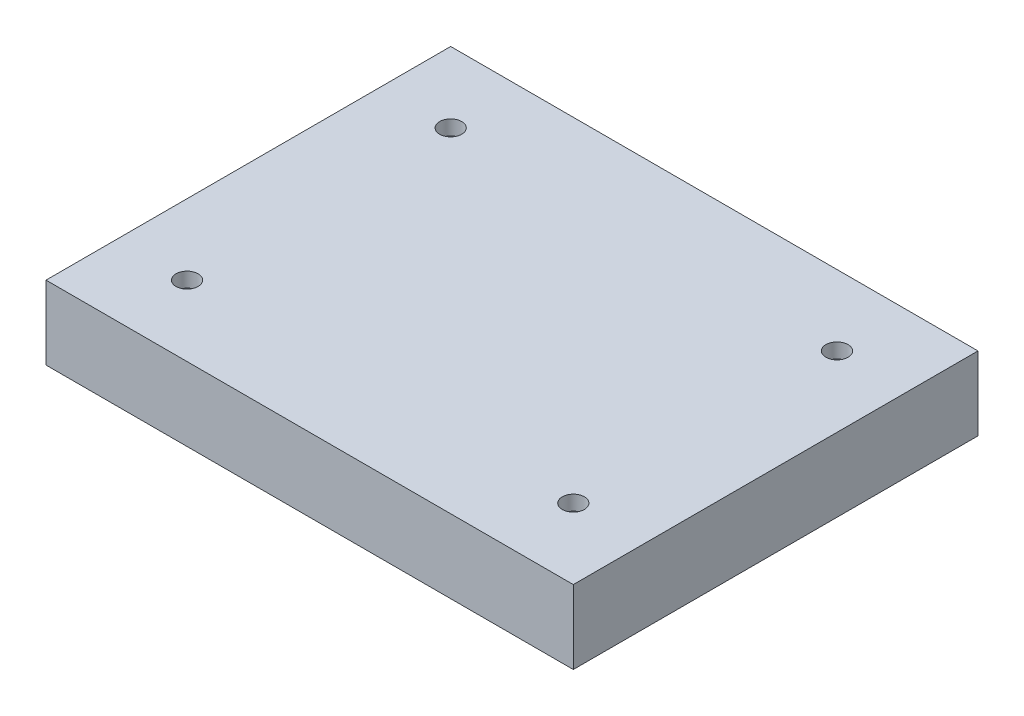
ISO-10303-21;
HEADER;
FILE_DESCRIPTION(('STEP AP214'),'2;1');
FILE_NAME('part.step','',(''),(''),'','','');
FILE_SCHEMA(('AUTOMOTIVE_DESIGN { 1 0 10303 214 1 1 1 1 }'));
ENDSEC;
DATA;
#1=APPLICATION_CONTEXT('core data for automotive mechanical design processes');
#2=APPLICATION_PROTOCOL_DEFINITION('international standard','automotive_design',2000,#1);
#3=PRODUCT_CONTEXT('',#1,'mechanical');
#4=PRODUCT('Part','Part','',(#3));
#5=PRODUCT_RELATED_PRODUCT_CATEGORY('part','',(#4));
#6=PRODUCT_DEFINITION_FORMATION('','',#4);
#7=PRODUCT_DEFINITION_CONTEXT('part definition',#1,'design');
#8=PRODUCT_DEFINITION('design','',#6,#7);
#9=PRODUCT_DEFINITION_SHAPE('','',#8);
#10=(LENGTH_UNIT() NAMED_UNIT(*) SI_UNIT(.MILLI.,.METRE.));
#11=(NAMED_UNIT(*) PLANE_ANGLE_UNIT() SI_UNIT($,.RADIAN.));
#12=(NAMED_UNIT(*) SI_UNIT($,.STERADIAN.) SOLID_ANGLE_UNIT());
#13=UNCERTAINTY_MEASURE_WITH_UNIT(LENGTH_MEASURE(1.E-05),#10,'distance_accuracy_value','');
#14=(GEOMETRIC_REPRESENTATION_CONTEXT(3) GLOBAL_UNCERTAINTY_ASSIGNED_CONTEXT((#13)) GLOBAL_UNIT_ASSIGNED_CONTEXT((#10,
#11,#12)) REPRESENTATION_CONTEXT('',''));
#15=CARTESIAN_POINT('',(0.,0.,0.));
#16=DIRECTION('',(0.,0.,1.));
#17=DIRECTION('',(1.,0.,0.));
#18=AXIS2_PLACEMENT_3D('',#15,#16,#17);
#19=CARTESIAN_POINT('',(43.,12.,33.));
#20=DIRECTION('',(-1.,0.,0.));
#21=DIRECTION('',(0.,0.,1.));
#22=AXIS2_PLACEMENT_3D('',#19,#20,#21);
#23=PLANE('',#22);
#24=DIRECTION('',(0.,0.,-1.));
#25=VECTOR('',#24,1.);
#26=CARTESIAN_POINT('',(43.,0.,33.));
#27=LINE('',#26,#25);
#28=CARTESIAN_POINT('',(43.,0.,33.));
#29=VERTEX_POINT('',#28);
#30=CARTESIAN_POINT('',(43.,0.,-33.));
#31=VERTEX_POINT('',#30);
#32=EDGE_CURVE('E153',#29,#31,#27,.T.);
#33=ORIENTED_EDGE('',*,*,#32,.T.);
#34=DIRECTION('',(0.,-1.,0.));
#35=VECTOR('',#34,1.);
#36=CARTESIAN_POINT('',(43.,12.,-33.));
#37=LINE('',#36,#35);
#38=CARTESIAN_POINT('',(43.,12.,-33.));
#39=VERTEX_POINT('',#38);
#40=EDGE_CURVE('E180',#39,#31,#37,.T.);
#41=ORIENTED_EDGE('',*,*,#40,.F.);
#42=DIRECTION('',(0.,0.,-1.));
#43=VECTOR('',#42,1.);
#44=CARTESIAN_POINT('',(43.,12.,33.));
#45=LINE('',#44,#43);
#46=CARTESIAN_POINT('',(43.,12.,33.));
#47=VERTEX_POINT('',#46);
#48=EDGE_CURVE('E160',#47,#39,#45,.T.);
#49=ORIENTED_EDGE('',*,*,#48,.F.);
#50=DIRECTION('',(0.,-1.,0.));
#51=VECTOR('',#50,1.);
#52=CARTESIAN_POINT('',(43.,12.,33.));
#53=LINE('',#52,#51);
#54=EDGE_CURVE('E162',#47,#29,#53,.T.);
#55=ORIENTED_EDGE('',*,*,#54,.T.);
#56=EDGE_LOOP('',(#33,#41,#49,#55));
#57=FACE_BOUND('',#56,.T.);
#58=ADVANCED_FACE('F39',(#57),#23,.F.);
#59=CARTESIAN_POINT('',(-43.,12.,-33.));
#60=DIRECTION('',(0.,0.,1.));
#61=DIRECTION('',(1.,0.,0.));
#62=AXIS2_PLACEMENT_3D('',#59,#60,#61);
#63=PLANE('',#62);
#64=DIRECTION('',(-1.,0.,0.));
#65=VECTOR('',#64,1.);
#66=CARTESIAN_POINT('',(-43.,0.,-33.));
#67=LINE('',#66,#65);
#68=CARTESIAN_POINT('',(-43.,0.,-33.));
#69=VERTEX_POINT('',#68);
#70=EDGE_CURVE('E167',#31,#69,#67,.T.);
#71=ORIENTED_EDGE('',*,*,#70,.T.);
#72=DIRECTION('',(0.,-1.,0.));
#73=VECTOR('',#72,1.);
#74=CARTESIAN_POINT('',(-43.,12.,-33.));
#75=LINE('',#74,#73);
#76=CARTESIAN_POINT('',(-43.,12.,-33.));
#77=VERTEX_POINT('',#76);
#78=EDGE_CURVE('E171',#77,#69,#75,.T.);
#79=ORIENTED_EDGE('',*,*,#78,.F.);
#80=DIRECTION('',(-1.,0.,0.));
#81=VECTOR('',#80,1.);
#82=CARTESIAN_POINT('',(-43.,12.,-33.));
#83=LINE('',#82,#81);
#84=EDGE_CURVE('E91',#39,#77,#83,.T.);
#85=ORIENTED_EDGE('',*,*,#84,.F.);
#86=ORIENTED_EDGE('',*,*,#40,.T.);
#87=EDGE_LOOP('',(#71,#79,#85,#86));
#88=FACE_BOUND('',#87,.T.);
#89=ADVANCED_FACE('F240',(#88),#63,.F.);
#90=CARTESIAN_POINT('',(-43.,12.,33.));
#91=DIRECTION('',(1.,0.,0.));
#92=DIRECTION('',(0.,0.,-1.));
#93=AXIS2_PLACEMENT_3D('',#90,#91,#92);
#94=PLANE('',#93);
#95=DIRECTION('',(0.,0.,1.));
#96=VECTOR('',#95,1.);
#97=CARTESIAN_POINT('',(-43.,0.,33.));
#98=LINE('',#97,#96);
#99=CARTESIAN_POINT('',(-43.,0.,33.));
#100=VERTEX_POINT('',#99);
#101=EDGE_CURVE('E169',#69,#100,#98,.T.);
#102=ORIENTED_EDGE('',*,*,#101,.T.);
#103=DIRECTION('',(0.,-1.,0.));
#104=VECTOR('',#103,1.);
#105=CARTESIAN_POINT('',(-43.,12.,33.));
#106=LINE('',#105,#104);
#107=CARTESIAN_POINT('',(-43.,12.,33.));
#108=VERTEX_POINT('',#107);
#109=EDGE_CURVE('E175',#108,#100,#106,.T.);
#110=ORIENTED_EDGE('',*,*,#109,.F.);
#111=DIRECTION('',(0.,0.,1.));
#112=VECTOR('',#111,1.);
#113=CARTESIAN_POINT('',(-43.,12.,33.));
#114=LINE('',#113,#112);
#115=EDGE_CURVE('E159',#77,#108,#114,.T.);
#116=ORIENTED_EDGE('',*,*,#115,.F.);
#117=ORIENTED_EDGE('',*,*,#78,.T.);
#118=EDGE_LOOP('',(#102,#110,#116,#117));
#119=FACE_BOUND('',#118,.T.);
#120=ADVANCED_FACE('F245',(#119),#94,.F.);
#121=CARTESIAN_POINT('',(-43.,12.,33.));
#122=DIRECTION('',(0.,0.,-1.));
#123=DIRECTION('',(-1.,0.,0.));
#124=AXIS2_PLACEMENT_3D('',#121,#122,#123);
#125=PLANE('',#124);
#126=DIRECTION('',(1.,0.,0.));
#127=VECTOR('',#126,1.);
#128=CARTESIAN_POINT('',(-43.,0.,33.));
#129=LINE('',#128,#127);
#130=EDGE_CURVE('E82',#100,#29,#129,.T.);
#131=ORIENTED_EDGE('',*,*,#130,.T.);
#132=ORIENTED_EDGE('',*,*,#54,.F.);
#133=DIRECTION('',(1.,0.,0.));
#134=VECTOR('',#133,1.);
#135=CARTESIAN_POINT('',(-43.,12.,33.));
#136=LINE('',#135,#134);
#137=EDGE_CURVE('E61',#108,#47,#136,.T.);
#138=ORIENTED_EDGE('',*,*,#137,.F.);
#139=ORIENTED_EDGE('',*,*,#109,.T.);
#140=EDGE_LOOP('',(#131,#132,#138,#139));
#141=FACE_BOUND('',#140,.T.);
#142=ADVANCED_FACE('F255',(#141),#125,.F.);
#143=CARTESIAN_POINT('',(0.,12.,0.));
#144=DIRECTION('',(0.,-1.,0.));
#145=DIRECTION('',(0.,0.,-1.));
#146=AXIS2_PLACEMENT_3D('',#143,#144,#145);
#147=PLANE('',#146);
#148=CARTESIAN_POINT('',(31.5,12.,-21.5));
#149=DIRECTION('',(0.,-1.,0.));
#150=DIRECTION('',(0.,0.,-1.));
#151=AXIS2_PLACEMENT_3D('',#148,#149,#150);
#152=CIRCLE('',#151,1.8);
#153=CARTESIAN_POINT('',(31.5,12.,-23.3));
#154=VERTEX_POINT('',#153);
#155=EDGE_CURVE('E45',#154,#154,#152,.T.);
#156=ORIENTED_EDGE('',*,*,#155,.T.);
#157=EDGE_LOOP('',(#156));
#158=FACE_BOUND('',#157,.T.);
#159=CARTESIAN_POINT('',(-31.5,12.,21.5));
#160=DIRECTION('',(0.,-1.,0.));
#161=DIRECTION('',(0.,0.,-1.));
#162=AXIS2_PLACEMENT_3D('',#159,#160,#161);
#163=CIRCLE('',#162,1.8);
#164=CARTESIAN_POINT('',(-31.5,12.,19.7));
#165=VERTEX_POINT('',#164);
#166=EDGE_CURVE('E191',#165,#165,#163,.T.);
#167=ORIENTED_EDGE('',*,*,#166,.T.);
#168=EDGE_LOOP('',(#167));
#169=FACE_BOUND('',#168,.T.);
#170=CARTESIAN_POINT('',(31.5,12.,21.5));
#171=DIRECTION('',(0.,-1.,0.));
#172=DIRECTION('',(0.,0.,-1.));
#173=AXIS2_PLACEMENT_3D('',#170,#171,#172);
#174=CIRCLE('',#173,1.8);
#175=CARTESIAN_POINT('',(31.5,12.,19.7));
#176=VERTEX_POINT('',#175);
#177=EDGE_CURVE('E188',#176,#176,#174,.T.);
#178=ORIENTED_EDGE('',*,*,#177,.T.);
#179=EDGE_LOOP('',(#178));
#180=FACE_BOUND('',#179,.T.);
#181=CARTESIAN_POINT('',(-31.5,12.,-21.5));
#182=DIRECTION('',(0.,-1.,0.));
#183=DIRECTION('',(0.,0.,-1.));
#184=AXIS2_PLACEMENT_3D('',#181,#182,#183);
#185=CIRCLE('',#184,1.8);
#186=CARTESIAN_POINT('',(-31.5,12.,-23.3));
#187=VERTEX_POINT('',#186);
#188=EDGE_CURVE('E190',#187,#187,#185,.T.);
#189=ORIENTED_EDGE('',*,*,#188,.T.);
#190=EDGE_LOOP('',(#189));
#191=FACE_BOUND('',#190,.T.);
#192=ORIENTED_EDGE('',*,*,#48,.T.);
#193=ORIENTED_EDGE('',*,*,#84,.T.);
#194=ORIENTED_EDGE('',*,*,#115,.T.);
#195=ORIENTED_EDGE('',*,*,#137,.T.);
#196=EDGE_LOOP('',(#192,#193,#194,#195));
#197=FACE_BOUND('',#196,.T.);
#198=ADVANCED_FACE('F252',(#158,#169,#180,#191,#197),#147,.F.);
#199=CARTESIAN_POINT('',(0.,0.,0.));
#200=DIRECTION('',(0.,-1.,0.));
#201=DIRECTION('',(0.,0.,-1.));
#202=AXIS2_PLACEMENT_3D('',#199,#200,#201);
#203=PLANE('',#202);
#204=DIRECTION('',(0.,0.,1.));
#205=VECTOR('',#204,1.);
#206=CARTESIAN_POINT('',(40.6,0.,-30.6));
#207=LINE('',#206,#205);
#208=CARTESIAN_POINT('',(40.6,0.,-30.6));
#209=VERTEX_POINT('',#208);
#210=CARTESIAN_POINT('',(40.6,0.,30.6));
#211=VERTEX_POINT('',#210);
#212=EDGE_CURVE('E54',#209,#211,#207,.T.);
#213=ORIENTED_EDGE('',*,*,#212,.F.);
#214=DIRECTION('',(1.,0.,0.));
#215=VECTOR('',#214,1.);
#216=CARTESIAN_POINT('',(-40.6,0.,-30.6));
#217=LINE('',#216,#215);
#218=CARTESIAN_POINT('',(-40.6,0.,-30.6));
#219=VERTEX_POINT('',#218);
#220=EDGE_CURVE('E133',#219,#209,#217,.T.);
#221=ORIENTED_EDGE('',*,*,#220,.F.);
#222=DIRECTION('',(0.,0.,-1.));
#223=VECTOR('',#222,1.);
#224=CARTESIAN_POINT('',(-40.6,0.,-30.6));
#225=LINE('',#224,#223);
#226=CARTESIAN_POINT('',(-40.6,0.,30.6));
#227=VERTEX_POINT('',#226);
#228=EDGE_CURVE('E136',#227,#219,#225,.T.);
#229=ORIENTED_EDGE('',*,*,#228,.F.);
#230=DIRECTION('',(-1.,0.,0.));
#231=VECTOR('',#230,1.);
#232=CARTESIAN_POINT('',(-40.6,0.,30.6));
#233=LINE('',#232,#231);
#234=EDGE_CURVE('E150',#211,#227,#233,.T.);
#235=ORIENTED_EDGE('',*,*,#234,.F.);
#236=EDGE_LOOP('',(#213,#221,#229,#235));
#237=FACE_BOUND('',#236,.T.);
#238=ORIENTED_EDGE('',*,*,#32,.F.);
#239=ORIENTED_EDGE('',*,*,#130,.F.);
#240=ORIENTED_EDGE('',*,*,#101,.F.);
#241=ORIENTED_EDGE('',*,*,#70,.F.);
#242=EDGE_LOOP('',(#238,#239,#240,#241));
#243=FACE_BOUND('',#242,.T.);
#244=ADVANCED_FACE('F250',(#237,#243),#203,.T.);
#245=CARTESIAN_POINT('',(40.6,9.6,-30.6));
#246=DIRECTION('',(1.,0.,0.));
#247=DIRECTION('',(0.,0.,-1.));
#248=AXIS2_PLACEMENT_3D('',#245,#246,#247);
#249=PLANE('',#248);
#250=ORIENTED_EDGE('',*,*,#212,.T.);
#251=DIRECTION('',(0.,-1.,0.));
#252=VECTOR('',#251,1.);
#253=CARTESIAN_POINT('',(40.6,9.6,30.6));
#254=LINE('',#253,#252);
#255=CARTESIAN_POINT('',(40.6,9.6,30.6));
#256=VERTEX_POINT('',#255);
#257=EDGE_CURVE('E114',#256,#211,#254,.T.);
#258=ORIENTED_EDGE('',*,*,#257,.F.);
#259=DIRECTION('',(0.,0.,1.));
#260=VECTOR('',#259,1.);
#261=CARTESIAN_POINT('',(40.6,9.6,-30.6));
#262=LINE('',#261,#260);
#263=CARTESIAN_POINT('',(40.6,9.6,-30.6));
#264=VERTEX_POINT('',#263);
#265=EDGE_CURVE('E120',#264,#256,#262,.T.);
#266=ORIENTED_EDGE('',*,*,#265,.F.);
#267=DIRECTION('',(0.,-1.,0.));
#268=VECTOR('',#267,1.);
#269=CARTESIAN_POINT('',(40.6,9.6,-30.6));
#270=LINE('',#269,#268);
#271=EDGE_CURVE('E151',#264,#209,#270,.T.);
#272=ORIENTED_EDGE('',*,*,#271,.T.);
#273=EDGE_LOOP('',(#250,#258,#266,#272));
#274=FACE_BOUND('',#273,.T.);
#275=ADVANCED_FACE('F113',(#274),#249,.F.);
#276=CARTESIAN_POINT('',(-40.6,9.6,-30.6));
#277=DIRECTION('',(0.,0.,-1.));
#278=DIRECTION('',(-1.,0.,0.));
#279=AXIS2_PLACEMENT_3D('',#276,#277,#278);
#280=PLANE('',#279);
#281=ORIENTED_EDGE('',*,*,#220,.T.);
#282=ORIENTED_EDGE('',*,*,#271,.F.);
#283=DIRECTION('',(1.,0.,0.));
#284=VECTOR('',#283,1.);
#285=CARTESIAN_POINT('',(-40.6,9.6,-30.6));
#286=LINE('',#285,#284);
#287=CARTESIAN_POINT('',(-40.6,9.6,-30.6));
#288=VERTEX_POINT('',#287);
#289=EDGE_CURVE('E121',#288,#264,#286,.T.);
#290=ORIENTED_EDGE('',*,*,#289,.F.);
#291=DIRECTION('',(0.,-1.,0.));
#292=VECTOR('',#291,1.);
#293=CARTESIAN_POINT('',(-40.6,9.6,-30.6));
#294=LINE('',#293,#292);
#295=EDGE_CURVE('E152',#288,#219,#294,.T.);
#296=ORIENTED_EDGE('',*,*,#295,.T.);
#297=EDGE_LOOP('',(#281,#282,#290,#296));
#298=FACE_BOUND('',#297,.T.);
#299=ADVANCED_FACE('F289',(#298),#280,.F.);
#300=CARTESIAN_POINT('',(-40.6,9.6,-30.6));
#301=DIRECTION('',(-1.,0.,0.));
#302=DIRECTION('',(0.,0.,1.));
#303=AXIS2_PLACEMENT_3D('',#300,#301,#302);
#304=PLANE('',#303);
#305=ORIENTED_EDGE('',*,*,#228,.T.);
#306=ORIENTED_EDGE('',*,*,#295,.F.);
#307=DIRECTION('',(0.,0.,-1.));
#308=VECTOR('',#307,1.);
#309=CARTESIAN_POINT('',(-40.6,9.6,-30.6));
#310=LINE('',#309,#308);
#311=CARTESIAN_POINT('',(-40.6,9.6,30.6));
#312=VERTEX_POINT('',#311);
#313=EDGE_CURVE('E132',#312,#288,#310,.T.);
#314=ORIENTED_EDGE('',*,*,#313,.F.);
#315=DIRECTION('',(0.,-1.,0.));
#316=VECTOR('',#315,1.);
#317=CARTESIAN_POINT('',(-40.6,9.6,30.6));
#318=LINE('',#317,#316);
#319=EDGE_CURVE('E125',#312,#227,#318,.T.);
#320=ORIENTED_EDGE('',*,*,#319,.T.);
#321=EDGE_LOOP('',(#305,#306,#314,#320));
#322=FACE_BOUND('',#321,.T.);
#323=ADVANCED_FACE('F233',(#322),#304,.F.);
#324=CARTESIAN_POINT('',(-40.6,9.6,30.6));
#325=DIRECTION('',(0.,0.,1.));
#326=DIRECTION('',(1.,0.,0.));
#327=AXIS2_PLACEMENT_3D('',#324,#325,#326);
#328=PLANE('',#327);
#329=ORIENTED_EDGE('',*,*,#234,.T.);
#330=ORIENTED_EDGE('',*,*,#319,.F.);
#331=DIRECTION('',(-1.,0.,0.));
#332=VECTOR('',#331,1.);
#333=CARTESIAN_POINT('',(-40.6,9.6,30.6));
#334=LINE('',#333,#332);
#335=EDGE_CURVE('E127',#256,#312,#334,.T.);
#336=ORIENTED_EDGE('',*,*,#335,.F.);
#337=ORIENTED_EDGE('',*,*,#257,.T.);
#338=EDGE_LOOP('',(#329,#330,#336,#337));
#339=FACE_BOUND('',#338,.T.);
#340=ADVANCED_FACE('F130',(#339),#328,.F.);
#341=CARTESIAN_POINT('',(0.,9.6,0.));
#342=DIRECTION('',(0.,1.,0.));
#343=DIRECTION('',(0.,0.,1.));
#344=AXIS2_PLACEMENT_3D('',#341,#342,#343);
#345=PLANE('',#344);
#346=CARTESIAN_POINT('',(31.5,9.6,-21.5));
#347=DIRECTION('',(0.,1.,0.));
#348=DIRECTION('',(0.,0.,1.));
#349=AXIS2_PLACEMENT_3D('',#346,#347,#348);
#350=CIRCLE('',#349,3.);
#351=CARTESIAN_POINT('',(31.5,9.6,-18.5));
#352=VERTEX_POINT('',#351);
#353=EDGE_CURVE('E11',#352,#352,#350,.F.);
#354=ORIENTED_EDGE('',*,*,#353,.F.);
#355=EDGE_LOOP('',(#354));
#356=FACE_BOUND('',#355,.T.);
#357=CARTESIAN_POINT('',(-31.5,9.6,21.5));
#358=DIRECTION('',(0.,1.,0.));
#359=DIRECTION('',(0.,0.,1.));
#360=AXIS2_PLACEMENT_3D('',#357,#358,#359);
#361=CIRCLE('',#360,3.);
#362=CARTESIAN_POINT('',(-31.5,9.6,24.5));
#363=VERTEX_POINT('',#362);
#364=EDGE_CURVE('E50',#363,#363,#361,.F.);
#365=ORIENTED_EDGE('',*,*,#364,.F.);
#366=EDGE_LOOP('',(#365));
#367=FACE_BOUND('',#366,.T.);
#368=CARTESIAN_POINT('',(31.5,9.6,21.5));
#369=DIRECTION('',(0.,1.,0.));
#370=DIRECTION('',(0.,0.,1.));
#371=AXIS2_PLACEMENT_3D('',#368,#369,#370);
#372=CIRCLE('',#371,3.);
#373=CARTESIAN_POINT('',(31.5,9.6,24.5));
#374=VERTEX_POINT('',#373);
#375=EDGE_CURVE('E185',#374,#374,#372,.F.);
#376=ORIENTED_EDGE('',*,*,#375,.F.);
#377=EDGE_LOOP('',(#376));
#378=FACE_BOUND('',#377,.T.);
#379=CARTESIAN_POINT('',(-31.5,9.6,-21.5));
#380=DIRECTION('',(0.,1.,0.));
#381=DIRECTION('',(0.,0.,1.));
#382=AXIS2_PLACEMENT_3D('',#379,#380,#381);
#383=CIRCLE('',#382,3.);
#384=CARTESIAN_POINT('',(-31.5,9.6,-18.5));
#385=VERTEX_POINT('',#384);
#386=EDGE_CURVE('E179',#385,#385,#383,.F.);
#387=ORIENTED_EDGE('',*,*,#386,.F.);
#388=EDGE_LOOP('',(#387));
#389=FACE_BOUND('',#388,.T.);
#390=ORIENTED_EDGE('',*,*,#265,.T.);
#391=ORIENTED_EDGE('',*,*,#335,.T.);
#392=ORIENTED_EDGE('',*,*,#313,.T.);
#393=ORIENTED_EDGE('',*,*,#289,.T.);
#394=EDGE_LOOP('',(#390,#391,#392,#393));
#395=FACE_BOUND('',#394,.T.);
#396=ADVANCED_FACE('F134',(#356,#367,#378,#389,#395),#345,.F.);
#397=CARTESIAN_POINT('',(-31.5,5.1,-21.5));
#398=DIRECTION('',(0.,1.,0.));
#399=DIRECTION('',(0.,0.,1.));
#400=AXIS2_PLACEMENT_3D('',#397,#398,#399);
#401=CYLINDRICAL_SURFACE('',#400,3.);
#402=CARTESIAN_POINT('',(-31.5,5.1,-21.5));
#403=DIRECTION('',(0.,-1.,0.));
#404=DIRECTION('',(0.,0.,-1.));
#405=AXIS2_PLACEMENT_3D('',#402,#403,#404);
#406=CIRCLE('',#405,3.);
#407=CARTESIAN_POINT('',(-31.5,5.1,-24.5));
#408=VERTEX_POINT('',#407);
#409=EDGE_CURVE('E143',#408,#408,#406,.T.);
#410=ORIENTED_EDGE('',*,*,#409,.F.);
#411=EDGE_LOOP('',(#410));
#412=FACE_BOUND('',#411,.T.);
#413=ORIENTED_EDGE('',*,*,#386,.T.);
#414=EDGE_LOOP('',(#413));
#415=FACE_BOUND('',#414,.T.);
#416=ADVANCED_FACE('F218',(#412,#415),#401,.T.);
#417=CARTESIAN_POINT('',(-31.5,5.1,-21.5));
#418=DIRECTION('',(0.,-1.,0.));
#419=DIRECTION('',(0.,0.,-1.));
#420=AXIS2_PLACEMENT_3D('',#417,#418,#419);
#421=PLANE('',#420);
#422=ORIENTED_EDGE('',*,*,#409,.T.);
#423=EDGE_LOOP('',(#422));
#424=FACE_BOUND('',#423,.T.);
#425=ADVANCED_FACE('F220',(#424),#421,.T.);
#426=CARTESIAN_POINT('',(31.5,5.1,21.5));
#427=DIRECTION('',(0.,1.,0.));
#428=DIRECTION('',(0.,0.,1.));
#429=AXIS2_PLACEMENT_3D('',#426,#427,#428);
#430=CYLINDRICAL_SURFACE('',#429,3.);
#431=CARTESIAN_POINT('',(31.5,5.1,21.5));
#432=DIRECTION('',(0.,-1.,0.));
#433=DIRECTION('',(0.,0.,-1.));
#434=AXIS2_PLACEMENT_3D('',#431,#432,#433);
#435=CIRCLE('',#434,3.);
#436=CARTESIAN_POINT('',(31.5,5.1,18.5));
#437=VERTEX_POINT('',#436);
#438=EDGE_CURVE('E196',#437,#437,#435,.T.);
#439=ORIENTED_EDGE('',*,*,#438,.F.);
#440=EDGE_LOOP('',(#439));
#441=FACE_BOUND('',#440,.T.);
#442=ORIENTED_EDGE('',*,*,#375,.T.);
#443=EDGE_LOOP('',(#442));
#444=FACE_BOUND('',#443,.T.);
#445=ADVANCED_FACE('F328',(#441,#444),#430,.T.);
#446=CARTESIAN_POINT('',(31.5,5.1,21.5));
#447=DIRECTION('',(0.,-1.,0.));
#448=DIRECTION('',(0.,0.,-1.));
#449=AXIS2_PLACEMENT_3D('',#446,#447,#448);
#450=PLANE('',#449);
#451=ORIENTED_EDGE('',*,*,#438,.T.);
#452=EDGE_LOOP('',(#451));
#453=FACE_BOUND('',#452,.T.);
#454=ADVANCED_FACE('F339',(#453),#450,.T.);
#455=CARTESIAN_POINT('',(-31.5,5.1,21.5));
#456=DIRECTION('',(0.,1.,0.));
#457=DIRECTION('',(0.,0.,1.));
#458=AXIS2_PLACEMENT_3D('',#455,#456,#457);
#459=CYLINDRICAL_SURFACE('',#458,3.);
#460=CARTESIAN_POINT('',(-31.5,5.1,21.5));
#461=DIRECTION('',(0.,-1.,0.));
#462=DIRECTION('',(0.,0.,-1.));
#463=AXIS2_PLACEMENT_3D('',#460,#461,#462);
#464=CIRCLE('',#463,3.);
#465=CARTESIAN_POINT('',(-31.5,5.1,18.5));
#466=VERTEX_POINT('',#465);
#467=EDGE_CURVE('E205',#466,#466,#464,.T.);
#468=ORIENTED_EDGE('',*,*,#467,.F.);
#469=EDGE_LOOP('',(#468));
#470=FACE_BOUND('',#469,.T.);
#471=ORIENTED_EDGE('',*,*,#364,.T.);
#472=EDGE_LOOP('',(#471));
#473=FACE_BOUND('',#472,.T.);
#474=ADVANCED_FACE('F346',(#470,#473),#459,.T.);
#475=CARTESIAN_POINT('',(-31.5,5.1,21.5));
#476=DIRECTION('',(0.,-1.,0.));
#477=DIRECTION('',(0.,0.,-1.));
#478=AXIS2_PLACEMENT_3D('',#475,#476,#477);
#479=PLANE('',#478);
#480=ORIENTED_EDGE('',*,*,#467,.T.);
#481=EDGE_LOOP('',(#480));
#482=FACE_BOUND('',#481,.T.);
#483=ADVANCED_FACE('F360',(#482),#479,.T.);
#484=CARTESIAN_POINT('',(31.5,5.1,-21.5));
#485=DIRECTION('',(0.,1.,0.));
#486=DIRECTION('',(0.,0.,1.));
#487=AXIS2_PLACEMENT_3D('',#484,#485,#486);
#488=CYLINDRICAL_SURFACE('',#487,3.);
#489=CARTESIAN_POINT('',(31.5,5.1,-21.5));
#490=DIRECTION('',(0.,-1.,0.));
#491=DIRECTION('',(0.,0.,-1.));
#492=AXIS2_PLACEMENT_3D('',#489,#490,#491);
#493=CIRCLE('',#492,3.);
#494=CARTESIAN_POINT('',(31.5,5.1,-24.5));
#495=VERTEX_POINT('',#494);
#496=EDGE_CURVE('E210',#495,#495,#493,.T.);
#497=ORIENTED_EDGE('',*,*,#496,.F.);
#498=EDGE_LOOP('',(#497));
#499=FACE_BOUND('',#498,.T.);
#500=ORIENTED_EDGE('',*,*,#353,.T.);
#501=EDGE_LOOP('',(#500));
#502=FACE_BOUND('',#501,.T.);
#503=ADVANCED_FACE('F370',(#499,#502),#488,.T.);
#504=CARTESIAN_POINT('',(31.5,5.1,-21.5));
#505=DIRECTION('',(0.,-1.,0.));
#506=DIRECTION('',(0.,0.,-1.));
#507=AXIS2_PLACEMENT_3D('',#504,#505,#506);
#508=PLANE('',#507);
#509=ORIENTED_EDGE('',*,*,#496,.T.);
#510=EDGE_LOOP('',(#509));
#511=FACE_BOUND('',#510,.T.);
#512=ADVANCED_FACE('F380',(#511),#508,.T.);
#513=CARTESIAN_POINT('',(-31.5,14.1,-21.5));
#514=DIRECTION('',(0.,-1.,0.));
#515=DIRECTION('',(0.,0.,-1.));
#516=AXIS2_PLACEMENT_3D('',#513,#514,#515);
#517=CYLINDRICAL_SURFACE('',#516,1.8);
#518=CARTESIAN_POINT('',(-31.5,9.6,-21.5));
#519=DIRECTION('',(0.,-1.,0.));
#520=DIRECTION('',(0.,0.,-1.));
#521=AXIS2_PLACEMENT_3D('',#518,#519,#520);
#522=CIRCLE('',#521,1.8);
#523=CARTESIAN_POINT('',(-31.5,9.6,-23.3));
#524=VERTEX_POINT('',#523);
#525=EDGE_CURVE('E193',#524,#524,#522,.T.);
#526=ORIENTED_EDGE('',*,*,#525,.T.);
#527=EDGE_LOOP('',(#526));
#528=FACE_BOUND('',#527,.T.);
#529=ORIENTED_EDGE('',*,*,#188,.F.);
#530=EDGE_LOOP('',(#529));
#531=FACE_BOUND('',#530,.T.);
#532=ADVANCED_FACE('F387',(#528,#531),#517,.F.);
#533=CARTESIAN_POINT('',(-31.5,9.6,-21.5));
#534=DIRECTION('',(0.,-1.,0.));
#535=DIRECTION('',(0.,0.,-1.));
#536=AXIS2_PLACEMENT_3D('',#533,#534,#535);
#537=PLANE('',#536);
#538=ORIENTED_EDGE('',*,*,#525,.F.);
#539=EDGE_LOOP('',(#538));
#540=FACE_BOUND('',#539,.T.);
#541=ADVANCED_FACE('F391',(#540),#537,.F.);
#542=CARTESIAN_POINT('',(31.5,14.1,21.5));
#543=DIRECTION('',(0.,-1.,0.));
#544=DIRECTION('',(0.,0.,-1.));
#545=AXIS2_PLACEMENT_3D('',#542,#543,#544);
#546=CYLINDRICAL_SURFACE('',#545,1.8);
#547=CARTESIAN_POINT('',(31.5,9.6,21.5));
#548=DIRECTION('',(0.,-1.,0.));
#549=DIRECTION('',(0.,0.,-1.));
#550=AXIS2_PLACEMENT_3D('',#547,#548,#549);
#551=CIRCLE('',#550,1.8);
#552=CARTESIAN_POINT('',(31.5,9.6,19.7));
#553=VERTEX_POINT('',#552);
#554=EDGE_CURVE('E475',#553,#553,#551,.T.);
#555=ORIENTED_EDGE('',*,*,#554,.T.);
#556=EDGE_LOOP('',(#555));
#557=FACE_BOUND('',#556,.T.);
#558=ORIENTED_EDGE('',*,*,#177,.F.);
#559=EDGE_LOOP('',(#558));
#560=FACE_BOUND('',#559,.T.);
#561=ADVANCED_FACE('F404',(#557,#560),#546,.F.);
#562=CARTESIAN_POINT('',(31.5,9.6,21.5));
#563=DIRECTION('',(0.,-1.,0.));
#564=DIRECTION('',(0.,0.,-1.));
#565=AXIS2_PLACEMENT_3D('',#562,#563,#564);
#566=PLANE('',#565);
#567=ORIENTED_EDGE('',*,*,#554,.F.);
#568=EDGE_LOOP('',(#567));
#569=FACE_BOUND('',#568,.T.);
#570=ADVANCED_FACE('F414',(#569),#566,.F.);
#571=CARTESIAN_POINT('',(-31.5,14.1,21.5));
#572=DIRECTION('',(0.,-1.,0.));
#573=DIRECTION('',(0.,0.,-1.));
#574=AXIS2_PLACEMENT_3D('',#571,#572,#573);
#575=CYLINDRICAL_SURFACE('',#574,1.8);
#576=CARTESIAN_POINT('',(-31.5,9.6,21.5));
#577=DIRECTION('',(0.,-1.,0.));
#578=DIRECTION('',(0.,0.,-1.));
#579=AXIS2_PLACEMENT_3D('',#576,#577,#578);
#580=CIRCLE('',#579,1.8);
#581=CARTESIAN_POINT('',(-31.5,9.6,19.7));
#582=VERTEX_POINT('',#581);
#583=EDGE_CURVE('E467',#582,#582,#580,.T.);
#584=ORIENTED_EDGE('',*,*,#583,.T.);
#585=EDGE_LOOP('',(#584));
#586=FACE_BOUND('',#585,.T.);
#587=ORIENTED_EDGE('',*,*,#166,.F.);
#588=EDGE_LOOP('',(#587));
#589=FACE_BOUND('',#588,.T.);
#590=ADVANCED_FACE('F424',(#586,#589),#575,.F.);
#591=CARTESIAN_POINT('',(-31.5,9.6,21.5));
#592=DIRECTION('',(0.,-1.,0.));
#593=DIRECTION('',(0.,0.,-1.));
#594=AXIS2_PLACEMENT_3D('',#591,#592,#593);
#595=PLANE('',#594);
#596=ORIENTED_EDGE('',*,*,#583,.F.);
#597=EDGE_LOOP('',(#596));
#598=FACE_BOUND('',#597,.T.);
#599=ADVANCED_FACE('F432',(#598),#595,.F.);
#600=CARTESIAN_POINT('',(31.5,14.1,-21.5));
#601=DIRECTION('',(0.,-1.,0.));
#602=DIRECTION('',(0.,0.,-1.));
#603=AXIS2_PLACEMENT_3D('',#600,#601,#602);
#604=CYLINDRICAL_SURFACE('',#603,1.8);
#605=CARTESIAN_POINT('',(31.5,9.6,-21.5));
#606=DIRECTION('',(0.,-1.,0.));
#607=DIRECTION('',(0.,0.,-1.));
#608=AXIS2_PLACEMENT_3D('',#605,#606,#607);
#609=CIRCLE('',#608,1.8);
#610=CARTESIAN_POINT('',(31.5,9.6,-23.3));
#611=VERTEX_POINT('',#610);
#612=EDGE_CURVE('E469',#611,#611,#609,.T.);
#613=ORIENTED_EDGE('',*,*,#612,.T.);
#614=EDGE_LOOP('',(#613));
#615=FACE_BOUND('',#614,.T.);
#616=ORIENTED_EDGE('',*,*,#155,.F.);
#617=EDGE_LOOP('',(#616));
#618=FACE_BOUND('',#617,.T.);
#619=ADVANCED_FACE('F441',(#615,#618),#604,.F.);
#620=CARTESIAN_POINT('',(31.5,9.6,-21.5));
#621=DIRECTION('',(0.,-1.,0.));
#622=DIRECTION('',(0.,0.,-1.));
#623=AXIS2_PLACEMENT_3D('',#620,#621,#622);
#624=PLANE('',#623);
#625=ORIENTED_EDGE('',*,*,#612,.F.);
#626=EDGE_LOOP('',(#625));
#627=FACE_BOUND('',#626,.T.);
#628=ADVANCED_FACE('F454',(#627),#624,.F.);
#629=CLOSED_SHELL('',(#58,#89,#120,#142,#198,#244,#275,#299,#323,#340,#396,#416,#425,#445,#454,
#474,#483,#503,#512,#532,#541,#561,#570,#590,#599,#619,#628));
#630=MANIFOLD_SOLID_BREP('B2',#629);
#631=ADVANCED_BREP_SHAPE_REPRESENTATION('',(#18,#630),#14);
#632=SHAPE_DEFINITION_REPRESENTATION(#9,#631);
ENDSEC;
END-ISO-10303-21;
